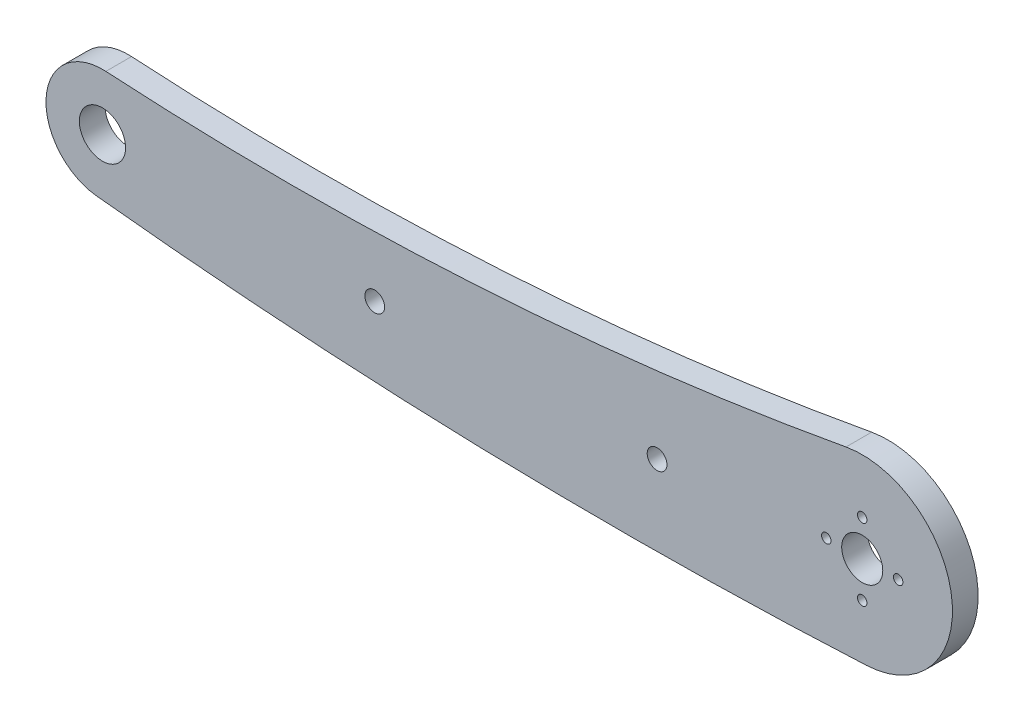
ISO-10303-21;
HEADER;
FILE_DESCRIPTION(('STEP AP214'),'2;1');
FILE_NAME('part.step','',(''),(''),'','','');
FILE_SCHEMA(('AUTOMOTIVE_DESIGN { 1 0 10303 214 1 1 1 1 }'));
ENDSEC;
DATA;
#1=APPLICATION_CONTEXT('core data for automotive mechanical design processes');
#2=APPLICATION_PROTOCOL_DEFINITION('international standard','automotive_design',2000,#1);
#3=PRODUCT_CONTEXT('',#1,'mechanical');
#4=PRODUCT('Part','Part','',(#3));
#5=PRODUCT_RELATED_PRODUCT_CATEGORY('part','',(#4));
#6=PRODUCT_DEFINITION_FORMATION('','',#4);
#7=PRODUCT_DEFINITION_CONTEXT('part definition',#1,'design');
#8=PRODUCT_DEFINITION('design','',#6,#7);
#9=PRODUCT_DEFINITION_SHAPE('','',#8);
#10=(LENGTH_UNIT() NAMED_UNIT(*) SI_UNIT(.MILLI.,.METRE.));
#11=(NAMED_UNIT(*) PLANE_ANGLE_UNIT() SI_UNIT($,.RADIAN.));
#12=(NAMED_UNIT(*) SI_UNIT($,.STERADIAN.) SOLID_ANGLE_UNIT());
#13=UNCERTAINTY_MEASURE_WITH_UNIT(LENGTH_MEASURE(1.E-05),#10,'distance_accuracy_value','');
#14=(GEOMETRIC_REPRESENTATION_CONTEXT(3) GLOBAL_UNCERTAINTY_ASSIGNED_CONTEXT((#13)) GLOBAL_UNIT_ASSIGNED_CONTEXT((#10,
#11,#12)) REPRESENTATION_CONTEXT('',''));
#15=CARTESIAN_POINT('',(0.,0.,0.));
#16=DIRECTION('',(0.,0.,1.));
#17=DIRECTION('',(1.,0.,0.));
#18=AXIS2_PLACEMENT_3D('',#15,#16,#17);
#19=CARTESIAN_POINT('',(15.1136429641292,303.064821475942,5.));
#20=DIRECTION('',(0.,0.,1.));
#21=DIRECTION('',(1.,0.,0.));
#22=AXIS2_PLACEMENT_3D('',#19,#20,#21);
#23=PLANE('',#22);
#24=CARTESIAN_POINT('',(70.7219256718031,-0.67427553093613,5.));
#25=DIRECTION('',(0.,0.,1.));
#26=DIRECTION('',(1.,0.,0.));
#27=AXIS2_PLACEMENT_3D('',#24,#25,#26);
#28=CIRCLE('',#27,4.00000000000001);
#29=CARTESIAN_POINT('',(74.7219256718031,-0.67427553093613,5.));
#30=VERTEX_POINT('',#29);
#31=EDGE_CURVE('E144',#30,#30,#28,.T.);
#32=ORIENTED_EDGE('',*,*,#31,.F.);
#33=EDGE_LOOP('',(#32));
#34=FACE_BOUND('',#33,.T.);
#35=CARTESIAN_POINT('',(63.7219256718032,-0.674275530936116,5.));
#36=DIRECTION('',(0.,0.,1.));
#37=DIRECTION('',(1.,0.,0.));
#38=AXIS2_PLACEMENT_3D('',#35,#36,#37);
#39=CIRCLE('',#38,0.924999999999957);
#40=CARTESIAN_POINT('',(64.6469256718032,-0.674275530936116,5.));
#41=VERTEX_POINT('',#40);
#42=EDGE_CURVE('E132',#41,#41,#39,.T.);
#43=ORIENTED_EDGE('',*,*,#42,.F.);
#44=EDGE_LOOP('',(#43));
#45=FACE_BOUND('',#44,.T.);
#46=CARTESIAN_POINT('',(77.7219256718032,-0.674275530936075,5.));
#47=DIRECTION('',(0.,0.,1.));
#48=DIRECTION('',(1.,0.,0.));
#49=AXIS2_PLACEMENT_3D('',#46,#47,#48);
#50=CIRCLE('',#49,0.924999999999957);
#51=CARTESIAN_POINT('',(78.6469256718032,-0.674275530936075,5.));
#52=VERTEX_POINT('',#51);
#53=EDGE_CURVE('E120',#52,#52,#50,.T.);
#54=ORIENTED_EDGE('',*,*,#53,.F.);
#55=EDGE_LOOP('',(#54));
#56=FACE_BOUND('',#55,.T.);
#57=CARTESIAN_POINT('',(30.7680403118794,-3.82658335950747,5.));
#58=DIRECTION('',(0.,0.,1.));
#59=DIRECTION('',(1.,0.,0.));
#60=AXIS2_PLACEMENT_3D('',#57,#58,#59);
#61=CIRCLE('',#60,1.92500000000007);
#62=CARTESIAN_POINT('',(32.6930403118795,-3.82658335950747,5.));
#63=VERTEX_POINT('',#62);
#64=EDGE_CURVE('E99',#63,#63,#61,.T.);
#65=ORIENTED_EDGE('',*,*,#64,.F.);
#66=EDGE_LOOP('',(#65));
#67=FACE_BOUND('',#66,.T.);
#68=CARTESIAN_POINT('',(-40.4946397435447,606.80391848282,5.));
#69=DIRECTION('',(0.,0.,-1.));
#70=DIRECTION('',(1.,0.,0.));
#71=AXIS2_PLACEMENT_3D('',#68,#69,#70);
#72=CIRCLE('',#71,600.);
#73=CARTESIAN_POINT('',(67.556915531861,16.6133887362247,5.));
#74=VERTEX_POINT('',#73);
#75=CARTESIAN_POINT('',(-76.596505758791,7.89102392283638,5.));
#76=VERTEX_POINT('',#75);
#77=EDGE_CURVE('E83',#74,#76,#72,.T.);
#78=ORIENTED_EDGE('',*,*,#77,.T.);
#79=CARTESIAN_POINT('',(-77.2583733024038,-3.08904581076352,5.));
#80=DIRECTION('',(0.,0.,1.));
#81=DIRECTION('',(1.,0.,0.));
#82=AXIS2_PLACEMENT_3D('',#79,#80,#81);
#83=CIRCLE('',#82,11.0000000000002);
#84=CARTESIAN_POINT('',(-78.4339326411999,-14.0260499819694,5.));
#85=VERTEX_POINT('',#84);
#86=EDGE_CURVE('E78',#76,#85,#83,.T.);
#87=ORIENTED_EDGE('',*,*,#86,.T.);
#88=CARTESIAN_POINT('',(23.0916466184591,930.533401167609,5.));
#89=DIRECTION('',(0.,0.,1.));
#90=DIRECTION('',(1.,0.,0.));
#91=AXIS2_PLACEMENT_3D('',#88,#89,#90);
#92=CIRCLE('',#91,950.);
#93=CARTESIAN_POINT('',(71.6196945586975,-18.2263305680453,5.));
#94=VERTEX_POINT('',#93);
#95=EDGE_CURVE('E81',#85,#94,#92,.T.);
#96=ORIENTED_EDGE('',*,*,#95,.T.);
#97=CARTESIAN_POINT('',(70.7219256718031,-0.67427553093613,5.));
#98=DIRECTION('',(0.,0.,1.));
#99=DIRECTION('',(1.,0.,0.));
#100=AXIS2_PLACEMENT_3D('',#97,#98,#99);
#101=CIRCLE('',#100,17.5750000000002);
#102=EDGE_CURVE('E49',#94,#74,#101,.T.);
#103=ORIENTED_EDGE('',*,*,#102,.T.);
#104=EDGE_LOOP('',(#78,#87,#96,#103));
#105=FACE_BOUND('',#104,.T.);
#106=CARTESIAN_POINT('',(-24.2246383609678,-4.72396420674093,5.));
#107=DIRECTION('',(0.,0.,1.));
#108=DIRECTION('',(1.,0.,0.));
#109=AXIS2_PLACEMENT_3D('',#106,#107,#108);
#110=CIRCLE('',#109,1.92500000000001);
#111=CARTESIAN_POINT('',(-22.2996383609678,-4.72396420674093,5.));
#112=VERTEX_POINT('',#111);
#113=EDGE_CURVE('E114',#112,#112,#110,.T.);
#114=ORIENTED_EDGE('',*,*,#113,.F.);
#115=EDGE_LOOP('',(#114));
#116=FACE_BOUND('',#115,.T.);
#117=CARTESIAN_POINT('',(70.7219256718033,-7.67427553093613,5.));
#118=DIRECTION('',(0.,0.,1.));
#119=DIRECTION('',(1.,0.,0.));
#120=AXIS2_PLACEMENT_3D('',#117,#118,#119);
#121=CIRCLE('',#120,0.924999999999957);
#122=CARTESIAN_POINT('',(71.6469256718032,-7.67427553093613,5.));
#123=VERTEX_POINT('',#122);
#124=EDGE_CURVE('E126',#123,#123,#121,.T.);
#125=ORIENTED_EDGE('',*,*,#124,.F.);
#126=EDGE_LOOP('',(#125));
#127=FACE_BOUND('',#126,.T.);
#128=CARTESIAN_POINT('',(70.7219256718031,6.32572446906387,5.));
#129=DIRECTION('',(0.,0.,1.));
#130=DIRECTION('',(1.,0.,0.));
#131=AXIS2_PLACEMENT_3D('',#128,#129,#130);
#132=CIRCLE('',#131,0.924999999999959);
#133=CARTESIAN_POINT('',(71.6469256718031,6.32572446906387,5.));
#134=VERTEX_POINT('',#133);
#135=EDGE_CURVE('E138',#134,#134,#132,.T.);
#136=ORIENTED_EDGE('',*,*,#135,.F.);
#137=EDGE_LOOP('',(#136));
#138=FACE_BOUND('',#137,.T.);
#139=CARTESIAN_POINT('',(-77.2583733024038,-3.08904581076352,5.));
#140=DIRECTION('',(0.,0.,1.));
#141=DIRECTION('',(1.,0.,0.));
#142=AXIS2_PLACEMENT_3D('',#139,#140,#141);
#143=CIRCLE('',#142,4.5);
#144=CARTESIAN_POINT('',(-72.7583733024038,-3.08904581076352,5.));
#145=VERTEX_POINT('',#144);
#146=EDGE_CURVE('E150',#145,#145,#143,.T.);
#147=ORIENTED_EDGE('',*,*,#146,.F.);
#148=EDGE_LOOP('',(#147));
#149=FACE_BOUND('',#148,.T.);
#150=ADVANCED_FACE('F32',(#34,#45,#56,#67,#105,#116,#127,#138,#149),#23,.T.);
#151=CARTESIAN_POINT('',(15.1136429641292,303.064821475942,0.));
#152=DIRECTION('',(0.,0.,1.));
#153=DIRECTION('',(1.,0.,0.));
#154=AXIS2_PLACEMENT_3D('',#151,#152,#153);
#155=PLANE('',#154);
#156=CARTESIAN_POINT('',(-40.4946397435447,606.80391848282,0.));
#157=DIRECTION('',(0.,0.,-1.));
#158=DIRECTION('',(1.,0.,0.));
#159=AXIS2_PLACEMENT_3D('',#156,#157,#158);
#160=CIRCLE('',#159,600.);
#161=CARTESIAN_POINT('',(67.556915531861,16.6133887362247,0.));
#162=VERTEX_POINT('',#161);
#163=CARTESIAN_POINT('',(-76.596505758791,7.89102392283638,0.));
#164=VERTEX_POINT('',#163);
#165=EDGE_CURVE('E96',#162,#164,#160,.T.);
#166=ORIENTED_EDGE('',*,*,#165,.F.);
#167=CARTESIAN_POINT('',(70.7219256718031,-0.67427553093613,0.));
#168=DIRECTION('',(0.,0.,1.));
#169=DIRECTION('',(1.,0.,0.));
#170=AXIS2_PLACEMENT_3D('',#167,#168,#169);
#171=CIRCLE('',#170,17.5750000000002);
#172=CARTESIAN_POINT('',(71.6196945586975,-18.2263305680453,0.));
#173=VERTEX_POINT('',#172);
#174=EDGE_CURVE('E71',#173,#162,#171,.T.);
#175=ORIENTED_EDGE('',*,*,#174,.F.);
#176=CARTESIAN_POINT('',(23.0916466184591,930.533401167609,0.));
#177=DIRECTION('',(0.,0.,1.));
#178=DIRECTION('',(1.,0.,0.));
#179=AXIS2_PLACEMENT_3D('',#176,#177,#178);
#180=CIRCLE('',#179,950.);
#181=CARTESIAN_POINT('',(-78.4339326411999,-14.0260499819694,0.));
#182=VERTEX_POINT('',#181);
#183=EDGE_CURVE('E65',#182,#173,#180,.T.);
#184=ORIENTED_EDGE('',*,*,#183,.F.);
#185=CARTESIAN_POINT('',(-77.2583733024038,-3.08904581076352,0.));
#186=DIRECTION('',(0.,0.,1.));
#187=DIRECTION('',(1.,0.,0.));
#188=AXIS2_PLACEMENT_3D('',#185,#186,#187);
#189=CIRCLE('',#188,11.0000000000002);
#190=EDGE_CURVE('E88',#164,#182,#189,.T.);
#191=ORIENTED_EDGE('',*,*,#190,.F.);
#192=EDGE_LOOP('',(#166,#175,#184,#191));
#193=FACE_BOUND('',#192,.T.);
#194=CARTESIAN_POINT('',(30.7680403118794,-3.82658335950747,0.));
#195=DIRECTION('',(0.,0.,1.));
#196=DIRECTION('',(1.,0.,0.));
#197=AXIS2_PLACEMENT_3D('',#194,#195,#196);
#198=CIRCLE('',#197,1.92500000000007);
#199=CARTESIAN_POINT('',(32.6930403118795,-3.82658335950747,0.));
#200=VERTEX_POINT('',#199);
#201=EDGE_CURVE('E111',#200,#200,#198,.T.);
#202=ORIENTED_EDGE('',*,*,#201,.T.);
#203=EDGE_LOOP('',(#202));
#204=FACE_BOUND('',#203,.T.);
#205=CARTESIAN_POINT('',(-24.2246383609678,-4.72396420674093,0.));
#206=DIRECTION('',(0.,0.,1.));
#207=DIRECTION('',(1.,0.,0.));
#208=AXIS2_PLACEMENT_3D('',#205,#206,#207);
#209=CIRCLE('',#208,1.92500000000001);
#210=CARTESIAN_POINT('',(-22.2996383609678,-4.72396420674093,0.));
#211=VERTEX_POINT('',#210);
#212=EDGE_CURVE('E117',#211,#211,#209,.T.);
#213=ORIENTED_EDGE('',*,*,#212,.T.);
#214=EDGE_LOOP('',(#213));
#215=FACE_BOUND('',#214,.T.);
#216=CARTESIAN_POINT('',(77.7219256718032,-0.674275530936075,0.));
#217=DIRECTION('',(0.,0.,1.));
#218=DIRECTION('',(1.,0.,0.));
#219=AXIS2_PLACEMENT_3D('',#216,#217,#218);
#220=CIRCLE('',#219,0.924999999999957);
#221=CARTESIAN_POINT('',(78.6469256718032,-0.674275530936075,0.));
#222=VERTEX_POINT('',#221);
#223=EDGE_CURVE('E123',#222,#222,#220,.T.);
#224=ORIENTED_EDGE('',*,*,#223,.T.);
#225=EDGE_LOOP('',(#224));
#226=FACE_BOUND('',#225,.T.);
#227=CARTESIAN_POINT('',(70.7219256718033,-7.67427553093613,0.));
#228=DIRECTION('',(0.,0.,1.));
#229=DIRECTION('',(1.,0.,0.));
#230=AXIS2_PLACEMENT_3D('',#227,#228,#229);
#231=CIRCLE('',#230,0.924999999999957);
#232=CARTESIAN_POINT('',(71.6469256718032,-7.67427553093613,0.));
#233=VERTEX_POINT('',#232);
#234=EDGE_CURVE('E129',#233,#233,#231,.T.);
#235=ORIENTED_EDGE('',*,*,#234,.T.);
#236=EDGE_LOOP('',(#235));
#237=FACE_BOUND('',#236,.T.);
#238=CARTESIAN_POINT('',(63.7219256718032,-0.674275530936116,0.));
#239=DIRECTION('',(0.,0.,1.));
#240=DIRECTION('',(1.,0.,0.));
#241=AXIS2_PLACEMENT_3D('',#238,#239,#240);
#242=CIRCLE('',#241,0.924999999999957);
#243=CARTESIAN_POINT('',(64.6469256718032,-0.674275530936116,0.));
#244=VERTEX_POINT('',#243);
#245=EDGE_CURVE('E135',#244,#244,#242,.T.);
#246=ORIENTED_EDGE('',*,*,#245,.T.);
#247=EDGE_LOOP('',(#246));
#248=FACE_BOUND('',#247,.T.);
#249=CARTESIAN_POINT('',(70.7219256718031,6.32572446906387,0.));
#250=DIRECTION('',(0.,0.,1.));
#251=DIRECTION('',(1.,0.,0.));
#252=AXIS2_PLACEMENT_3D('',#249,#250,#251);
#253=CIRCLE('',#252,0.924999999999959);
#254=CARTESIAN_POINT('',(71.6469256718031,6.32572446906387,0.));
#255=VERTEX_POINT('',#254);
#256=EDGE_CURVE('E141',#255,#255,#253,.T.);
#257=ORIENTED_EDGE('',*,*,#256,.T.);
#258=EDGE_LOOP('',(#257));
#259=FACE_BOUND('',#258,.T.);
#260=CARTESIAN_POINT('',(70.7219256718031,-0.67427553093613,0.));
#261=DIRECTION('',(0.,0.,1.));
#262=DIRECTION('',(1.,0.,0.));
#263=AXIS2_PLACEMENT_3D('',#260,#261,#262);
#264=CIRCLE('',#263,4.00000000000001);
#265=CARTESIAN_POINT('',(74.7219256718031,-0.67427553093613,0.));
#266=VERTEX_POINT('',#265);
#267=EDGE_CURVE('E147',#266,#266,#264,.T.);
#268=ORIENTED_EDGE('',*,*,#267,.T.);
#269=EDGE_LOOP('',(#268));
#270=FACE_BOUND('',#269,.T.);
#271=CARTESIAN_POINT('',(-77.2583733024038,-3.08904581076352,0.));
#272=DIRECTION('',(0.,0.,1.));
#273=DIRECTION('',(1.,0.,0.));
#274=AXIS2_PLACEMENT_3D('',#271,#272,#273);
#275=CIRCLE('',#274,4.5);
#276=CARTESIAN_POINT('',(-72.7583733024038,-3.08904581076352,0.));
#277=VERTEX_POINT('',#276);
#278=EDGE_CURVE('E153',#277,#277,#275,.T.);
#279=ORIENTED_EDGE('',*,*,#278,.T.);
#280=EDGE_LOOP('',(#279));
#281=FACE_BOUND('',#280,.T.);
#282=ADVANCED_FACE('F107',(#193,#204,#215,#226,#237,#248,#259,#270,#281),#155,.F.);
#283=CARTESIAN_POINT('',(-40.4946397435447,606.80391848282,5.));
#284=DIRECTION('',(0.,0.,-1.));
#285=DIRECTION('',(-1.,0.,0.));
#286=AXIS2_PLACEMENT_3D('',#283,#284,#285);
#287=CYLINDRICAL_SURFACE('',#286,600.);
#288=ORIENTED_EDGE('',*,*,#165,.T.);
#289=DIRECTION('',(0.,0.,-1.));
#290=VECTOR('',#289,1.);
#291=CARTESIAN_POINT('',(-76.596505758791,7.89102392283638,5.));
#292=LINE('',#291,#290);
#293=EDGE_CURVE('E11',#76,#164,#292,.T.);
#294=ORIENTED_EDGE('',*,*,#293,.F.);
#295=ORIENTED_EDGE('',*,*,#77,.F.);
#296=DIRECTION('',(0.,0.,-1.));
#297=VECTOR('',#296,1.);
#298=CARTESIAN_POINT('',(67.556915531861,16.6133887362247,5.));
#299=LINE('',#298,#297);
#300=EDGE_CURVE('E92',#74,#162,#299,.T.);
#301=ORIENTED_EDGE('',*,*,#300,.T.);
#302=EDGE_LOOP('',(#288,#294,#295,#301));
#303=FACE_BOUND('',#302,.T.);
#304=ADVANCED_FACE('F34',(#303),#287,.F.);
#305=CARTESIAN_POINT('',(-77.2583733024038,-3.08904581076352,5.));
#306=DIRECTION('',(0.,0.,-1.));
#307=DIRECTION('',(-1.,0.,0.));
#308=AXIS2_PLACEMENT_3D('',#305,#306,#307);
#309=CYLINDRICAL_SURFACE('',#308,11.0000000000002);
#310=ORIENTED_EDGE('',*,*,#190,.T.);
#311=DIRECTION('',(0.,0.,-1.));
#312=VECTOR('',#311,1.);
#313=CARTESIAN_POINT('',(-78.4339326411999,-14.0260499819694,5.));
#314=LINE('',#313,#312);
#315=EDGE_CURVE('E41',#85,#182,#314,.T.);
#316=ORIENTED_EDGE('',*,*,#315,.F.);
#317=ORIENTED_EDGE('',*,*,#86,.F.);
#318=ORIENTED_EDGE('',*,*,#293,.T.);
#319=EDGE_LOOP('',(#310,#316,#317,#318));
#320=FACE_BOUND('',#319,.T.);
#321=ADVANCED_FACE('F87',(#320),#309,.T.);
#322=CARTESIAN_POINT('',(23.0916466184591,930.533401167609,5.));
#323=DIRECTION('',(0.,0.,-1.));
#324=DIRECTION('',(-1.,0.,0.));
#325=AXIS2_PLACEMENT_3D('',#322,#323,#324);
#326=CYLINDRICAL_SURFACE('',#325,950.);
#327=ORIENTED_EDGE('',*,*,#183,.T.);
#328=DIRECTION('',(0.,0.,-1.));
#329=VECTOR('',#328,1.);
#330=CARTESIAN_POINT('',(71.6196945586975,-18.2263305680453,5.));
#331=LINE('',#330,#329);
#332=EDGE_CURVE('E89',#94,#173,#331,.T.);
#333=ORIENTED_EDGE('',*,*,#332,.F.);
#334=ORIENTED_EDGE('',*,*,#95,.F.);
#335=ORIENTED_EDGE('',*,*,#315,.T.);
#336=EDGE_LOOP('',(#327,#333,#334,#335));
#337=FACE_BOUND('',#336,.T.);
#338=ADVANCED_FACE('F90',(#337),#326,.T.);
#339=CARTESIAN_POINT('',(70.7219256718031,-0.67427553093613,5.));
#340=DIRECTION('',(0.,0.,-1.));
#341=DIRECTION('',(-1.,0.,0.));
#342=AXIS2_PLACEMENT_3D('',#339,#340,#341);
#343=CYLINDRICAL_SURFACE('',#342,17.5750000000002);
#344=ORIENTED_EDGE('',*,*,#174,.T.);
#345=ORIENTED_EDGE('',*,*,#300,.F.);
#346=ORIENTED_EDGE('',*,*,#102,.F.);
#347=ORIENTED_EDGE('',*,*,#332,.T.);
#348=EDGE_LOOP('',(#344,#345,#346,#347));
#349=FACE_BOUND('',#348,.T.);
#350=ADVANCED_FACE('F104',(#349),#343,.T.);
#351=CARTESIAN_POINT('',(30.7680403118794,-3.82658335950747,5.));
#352=DIRECTION('',(0.,0.,-1.));
#353=DIRECTION('',(-1.,0.,0.));
#354=AXIS2_PLACEMENT_3D('',#351,#352,#353);
#355=CYLINDRICAL_SURFACE('',#354,1.92500000000007);
#356=ORIENTED_EDGE('',*,*,#64,.T.);
#357=EDGE_LOOP('',(#356));
#358=FACE_BOUND('',#357,.T.);
#359=ORIENTED_EDGE('',*,*,#201,.F.);
#360=EDGE_LOOP('',(#359));
#361=FACE_BOUND('',#360,.T.);
#362=ADVANCED_FACE('F172',(#358,#361),#355,.F.);
#363=CARTESIAN_POINT('',(-24.2246383609678,-4.72396420674093,5.));
#364=DIRECTION('',(0.,0.,-1.));
#365=DIRECTION('',(-1.,0.,0.));
#366=AXIS2_PLACEMENT_3D('',#363,#364,#365);
#367=CYLINDRICAL_SURFACE('',#366,1.92500000000001);
#368=ORIENTED_EDGE('',*,*,#113,.T.);
#369=EDGE_LOOP('',(#368));
#370=FACE_BOUND('',#369,.T.);
#371=ORIENTED_EDGE('',*,*,#212,.F.);
#372=EDGE_LOOP('',(#371));
#373=FACE_BOUND('',#372,.T.);
#374=ADVANCED_FACE('F221',(#370,#373),#367,.F.);
#375=CARTESIAN_POINT('',(77.7219256718032,-0.674275530936075,5.));
#376=DIRECTION('',(0.,0.,-1.));
#377=DIRECTION('',(-1.,0.,0.));
#378=AXIS2_PLACEMENT_3D('',#375,#376,#377);
#379=CYLINDRICAL_SURFACE('',#378,0.924999999999957);
#380=ORIENTED_EDGE('',*,*,#53,.T.);
#381=EDGE_LOOP('',(#380));
#382=FACE_BOUND('',#381,.T.);
#383=ORIENTED_EDGE('',*,*,#223,.F.);
#384=EDGE_LOOP('',(#383));
#385=FACE_BOUND('',#384,.T.);
#386=ADVANCED_FACE('F229',(#382,#385),#379,.F.);
#387=CARTESIAN_POINT('',(70.7219256718033,-7.67427553093613,5.));
#388=DIRECTION('',(0.,0.,-1.));
#389=DIRECTION('',(-1.,0.,0.));
#390=AXIS2_PLACEMENT_3D('',#387,#388,#389);
#391=CYLINDRICAL_SURFACE('',#390,0.924999999999957);
#392=ORIENTED_EDGE('',*,*,#124,.T.);
#393=EDGE_LOOP('',(#392));
#394=FACE_BOUND('',#393,.T.);
#395=ORIENTED_EDGE('',*,*,#234,.F.);
#396=EDGE_LOOP('',(#395));
#397=FACE_BOUND('',#396,.T.);
#398=ADVANCED_FACE('F237',(#394,#397),#391,.F.);
#399=CARTESIAN_POINT('',(63.7219256718032,-0.674275530936116,5.));
#400=DIRECTION('',(0.,0.,-1.));
#401=DIRECTION('',(-1.,0.,0.));
#402=AXIS2_PLACEMENT_3D('',#399,#400,#401);
#403=CYLINDRICAL_SURFACE('',#402,0.924999999999957);
#404=ORIENTED_EDGE('',*,*,#42,.T.);
#405=EDGE_LOOP('',(#404));
#406=FACE_BOUND('',#405,.T.);
#407=ORIENTED_EDGE('',*,*,#245,.F.);
#408=EDGE_LOOP('',(#407));
#409=FACE_BOUND('',#408,.T.);
#410=ADVANCED_FACE('F246',(#406,#409),#403,.F.);
#411=CARTESIAN_POINT('',(70.7219256718031,6.32572446906387,5.));
#412=DIRECTION('',(0.,0.,-1.));
#413=DIRECTION('',(-1.,0.,0.));
#414=AXIS2_PLACEMENT_3D('',#411,#412,#413);
#415=CYLINDRICAL_SURFACE('',#414,0.924999999999959);
#416=ORIENTED_EDGE('',*,*,#135,.T.);
#417=EDGE_LOOP('',(#416));
#418=FACE_BOUND('',#417,.T.);
#419=ORIENTED_EDGE('',*,*,#256,.F.);
#420=EDGE_LOOP('',(#419));
#421=FACE_BOUND('',#420,.T.);
#422=ADVANCED_FACE('F255',(#418,#421),#415,.F.);
#423=CARTESIAN_POINT('',(70.7219256718031,-0.67427553093613,5.));
#424=DIRECTION('',(0.,0.,-1.));
#425=DIRECTION('',(-1.,0.,0.));
#426=AXIS2_PLACEMENT_3D('',#423,#424,#425);
#427=CYLINDRICAL_SURFACE('',#426,4.00000000000001);
#428=ORIENTED_EDGE('',*,*,#31,.T.);
#429=EDGE_LOOP('',(#428));
#430=FACE_BOUND('',#429,.T.);
#431=ORIENTED_EDGE('',*,*,#267,.F.);
#432=EDGE_LOOP('',(#431));
#433=FACE_BOUND('',#432,.T.);
#434=ADVANCED_FACE('F264',(#430,#433),#427,.F.);
#435=CARTESIAN_POINT('',(-77.2583733024038,-3.08904581076352,5.));
#436=DIRECTION('',(0.,0.,-1.));
#437=DIRECTION('',(-1.,0.,0.));
#438=AXIS2_PLACEMENT_3D('',#435,#436,#437);
#439=CYLINDRICAL_SURFACE('',#438,4.5);
#440=ORIENTED_EDGE('',*,*,#146,.T.);
#441=EDGE_LOOP('',(#440));
#442=FACE_BOUND('',#441,.T.);
#443=ORIENTED_EDGE('',*,*,#278,.F.);
#444=EDGE_LOOP('',(#443));
#445=FACE_BOUND('',#444,.T.);
#446=ADVANCED_FACE('F159',(#442,#445),#439,.F.);
#447=CLOSED_SHELL('',(#150,#282,#304,#321,#338,#350,#362,#374,#386,#398,#410,#422,#434,#446));
#448=MANIFOLD_SOLID_BREP('B2',#447);
#449=ADVANCED_BREP_SHAPE_REPRESENTATION('',(#18,#448),#14);
#450=SHAPE_DEFINITION_REPRESENTATION(#9,#449);
ENDSEC;
END-ISO-10303-21;
